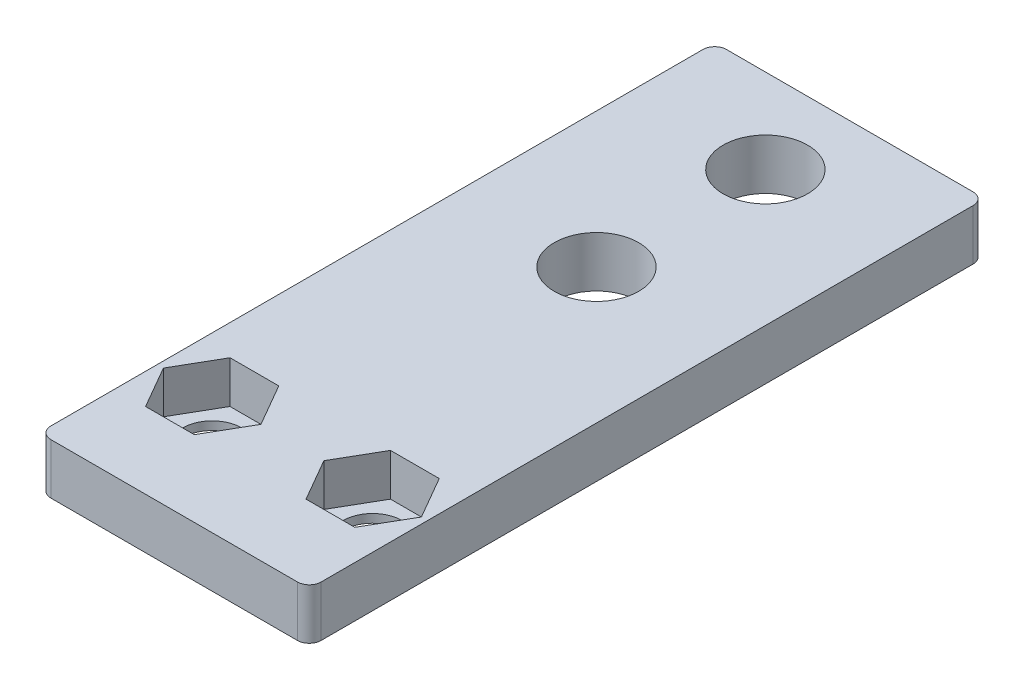
ISO-10303-21;
HEADER;
FILE_DESCRIPTION(('STEP AP214'),'2;1');
FILE_NAME('part.step','',(''),(''),'','','');
FILE_SCHEMA(('AUTOMOTIVE_DESIGN { 1 0 10303 214 1 1 1 1 }'));
ENDSEC;
DATA;
#1=APPLICATION_CONTEXT('core data for automotive mechanical design processes');
#2=APPLICATION_PROTOCOL_DEFINITION('international standard','automotive_design',2000,#1);
#3=PRODUCT_CONTEXT('',#1,'mechanical');
#4=PRODUCT('Part','Part','',(#3));
#5=PRODUCT_RELATED_PRODUCT_CATEGORY('part','',(#4));
#6=PRODUCT_DEFINITION_FORMATION('','',#4);
#7=PRODUCT_DEFINITION_CONTEXT('part definition',#1,'design');
#8=PRODUCT_DEFINITION('design','',#6,#7);
#9=PRODUCT_DEFINITION_SHAPE('','',#8);
#10=(LENGTH_UNIT() NAMED_UNIT(*) SI_UNIT(.MILLI.,.METRE.));
#11=(NAMED_UNIT(*) PLANE_ANGLE_UNIT() SI_UNIT($,.RADIAN.));
#12=(NAMED_UNIT(*) SI_UNIT($,.STERADIAN.) SOLID_ANGLE_UNIT());
#13=UNCERTAINTY_MEASURE_WITH_UNIT(LENGTH_MEASURE(1.E-05),#10,'distance_accuracy_value','');
#14=(GEOMETRIC_REPRESENTATION_CONTEXT(3) GLOBAL_UNCERTAINTY_ASSIGNED_CONTEXT((#13)) GLOBAL_UNIT_ASSIGNED_CONTEXT((#10,
#11,#12)) REPRESENTATION_CONTEXT('',''));
#15=CARTESIAN_POINT('',(0.,0.,0.));
#16=DIRECTION('',(0.,0.,1.));
#17=DIRECTION('',(1.,0.,0.));
#18=AXIS2_PLACEMENT_3D('',#15,#16,#17);
#19=CARTESIAN_POINT('',(0.,3.,0.));
#20=DIRECTION('',(0.,0.,-1.));
#21=DIRECTION('',(-1.,0.,0.));
#22=AXIS2_PLACEMENT_3D('',#19,#20,#21);
#23=PLANE('',#22);
#24=DIRECTION('',(1.,0.,0.));
#25=VECTOR('',#24,1.);
#26=CARTESIAN_POINT('',(0.,3.,0.));
#27=LINE('',#26,#25);
#28=CARTESIAN_POINT('',(0.7,3.,0.));
#29=VERTEX_POINT('',#28);
#30=CARTESIAN_POINT('',(15.3,3.,0.));
#31=VERTEX_POINT('',#30);
#32=EDGE_CURVE('E312',#29,#31,#27,.T.);
#33=ORIENTED_EDGE('',*,*,#32,.F.);
#34=DIRECTION('',(0.,-1.,0.));
#35=VECTOR('',#34,1.);
#36=CARTESIAN_POINT('',(0.7,0.,0.));
#37=LINE('',#36,#35);
#38=CARTESIAN_POINT('',(0.7,0.,0.));
#39=VERTEX_POINT('',#38);
#40=EDGE_CURVE('E390',#29,#39,#37,.T.);
#41=ORIENTED_EDGE('',*,*,#40,.T.);
#42=DIRECTION('',(1.,0.,0.));
#43=VECTOR('',#42,1.);
#44=CARTESIAN_POINT('',(0.,0.,0.));
#45=LINE('',#44,#43);
#46=CARTESIAN_POINT('',(15.3,0.,0.));
#47=VERTEX_POINT('',#46);
#48=EDGE_CURVE('E333',#39,#47,#45,.T.);
#49=ORIENTED_EDGE('',*,*,#48,.T.);
#50=DIRECTION('',(0.,-1.,0.));
#51=VECTOR('',#50,1.);
#52=CARTESIAN_POINT('',(15.3,3.,0.));
#53=LINE('',#52,#51);
#54=EDGE_CURVE('E372',#47,#31,#53,.F.);
#55=ORIENTED_EDGE('',*,*,#54,.T.);
#56=EDGE_LOOP('',(#33,#41,#49,#55));
#57=FACE_BOUND('',#56,.T.);
#58=ADVANCED_FACE('F41',(#57),#23,.F.);
#59=CARTESIAN_POINT('',(16.,3.,0.));
#60=DIRECTION('',(-1.,0.,0.));
#61=DIRECTION('',(0.,0.,1.));
#62=AXIS2_PLACEMENT_3D('',#59,#60,#61);
#63=PLANE('',#62);
#64=DIRECTION('',(0.,0.,-1.));
#65=VECTOR('',#64,1.);
#66=CARTESIAN_POINT('',(16.,3.,0.));
#67=LINE('',#66,#65);
#68=CARTESIAN_POINT('',(16.,3.,-0.7));
#69=VERTEX_POINT('',#68);
#70=CARTESIAN_POINT('',(16.,3.,-39.3));
#71=VERTEX_POINT('',#70);
#72=EDGE_CURVE('E316',#69,#71,#67,.T.);
#73=ORIENTED_EDGE('',*,*,#72,.F.);
#74=DIRECTION('',(0.,-1.,0.));
#75=VECTOR('',#74,1.);
#76=CARTESIAN_POINT('',(16.,3.,-0.7));
#77=LINE('',#76,#75);
#78=CARTESIAN_POINT('',(16.,0.,-0.7));
#79=VERTEX_POINT('',#78);
#80=EDGE_CURVE('E427',#69,#79,#77,.T.);
#81=ORIENTED_EDGE('',*,*,#80,.T.);
#82=DIRECTION('',(0.,0.,-1.));
#83=VECTOR('',#82,1.);
#84=CARTESIAN_POINT('',(16.,0.,0.));
#85=LINE('',#84,#83);
#86=CARTESIAN_POINT('',(16.,0.,-39.3));
#87=VERTEX_POINT('',#86);
#88=EDGE_CURVE('E337',#79,#87,#85,.T.);
#89=ORIENTED_EDGE('',*,*,#88,.T.);
#90=DIRECTION('',(0.,-1.,0.));
#91=VECTOR('',#90,1.);
#92=CARTESIAN_POINT('',(16.,3.,-39.3));
#93=LINE('',#92,#91);
#94=EDGE_CURVE('E424',#87,#71,#93,.F.);
#95=ORIENTED_EDGE('',*,*,#94,.T.);
#96=EDGE_LOOP('',(#73,#81,#89,#95));
#97=FACE_BOUND('',#96,.T.);
#98=ADVANCED_FACE('F435',(#97),#63,.F.);
#99=CARTESIAN_POINT('',(0.,3.,-40.));
#100=DIRECTION('',(0.,0.,-1.));
#101=DIRECTION('',(-1.,0.,0.));
#102=AXIS2_PLACEMENT_3D('',#99,#100,#101);
#103=PLANE('',#102);
#104=DIRECTION('',(1.,0.,0.));
#105=VECTOR('',#104,1.);
#106=CARTESIAN_POINT('',(0.,3.,-40.));
#107=LINE('',#106,#105);
#108=CARTESIAN_POINT('',(0.7,3.,-40.));
#109=VERTEX_POINT('',#108);
#110=CARTESIAN_POINT('',(15.3,3.,-40.));
#111=VERTEX_POINT('',#110);
#112=EDGE_CURVE('E319',#109,#111,#107,.T.);
#113=ORIENTED_EDGE('',*,*,#112,.T.);
#114=DIRECTION('',(0.,-1.,0.));
#115=VECTOR('',#114,1.);
#116=CARTESIAN_POINT('',(15.3,0.,-40.));
#117=LINE('',#116,#115);
#118=CARTESIAN_POINT('',(15.3,0.,-40.));
#119=VERTEX_POINT('',#118);
#120=EDGE_CURVE('E11',#111,#119,#117,.T.);
#121=ORIENTED_EDGE('',*,*,#120,.T.);
#122=DIRECTION('',(1.,0.,0.));
#123=VECTOR('',#122,1.);
#124=CARTESIAN_POINT('',(0.,0.,-40.));
#125=LINE('',#124,#123);
#126=CARTESIAN_POINT('',(0.7,0.,-40.));
#127=VERTEX_POINT('',#126);
#128=EDGE_CURVE('E341',#127,#119,#125,.T.);
#129=ORIENTED_EDGE('',*,*,#128,.F.);
#130=DIRECTION('',(0.,-1.,0.));
#131=VECTOR('',#130,1.);
#132=CARTESIAN_POINT('',(0.7,3.,-40.));
#133=LINE('',#132,#131);
#134=EDGE_CURVE('E50',#127,#109,#133,.F.);
#135=ORIENTED_EDGE('',*,*,#134,.T.);
#136=EDGE_LOOP('',(#113,#121,#129,#135));
#137=FACE_BOUND('',#136,.T.);
#138=ADVANCED_FACE('F446',(#137),#103,.T.);
#139=CARTESIAN_POINT('',(7.63365242270663,3.,-4.40729128114969));
#140=DIRECTION('',(-0.866025403784439,0.,0.499999999999999));
#141=DIRECTION('',(0.499999999999999,0.,0.866025403784439));
#142=AXIS2_PLACEMENT_3D('',#139,#140,#141);
#143=PLANE('',#142);
#144=DIRECTION('',(-0.499999999999999,0.,-0.86602540378444));
#145=VECTOR('',#144,1.);
#146=CARTESIAN_POINT('',(7.63365242270663,0.5,-4.40729128114969));
#147=LINE('',#146,#145);
#148=CARTESIAN_POINT('',(6.13675134594812,0.5,-6.99999999999999));
#149=VERTEX_POINT('',#148);
#150=CARTESIAN_POINT('',(4.69337567297406,0.5,-9.5));
#151=VERTEX_POINT('',#150);
#152=EDGE_CURVE('E234',#149,#151,#147,.T.);
#153=ORIENTED_EDGE('',*,*,#152,.F.);
#154=DIRECTION('',(0.,-1.,0.));
#155=VECTOR('',#154,1.);
#156=CARTESIAN_POINT('',(6.13675134594812,3.,-6.99999999999999));
#157=LINE('',#156,#155);
#158=CARTESIAN_POINT('',(6.13675134594812,3.,-6.99999999999999));
#159=VERTEX_POINT('',#158);
#160=EDGE_CURVE('E368',#159,#149,#157,.T.);
#161=ORIENTED_EDGE('',*,*,#160,.F.);
#162=DIRECTION('',(-0.499999999999999,0.,-0.86602540378444));
#163=VECTOR('',#162,1.);
#164=CARTESIAN_POINT('',(7.63365242270663,3.,-4.40729128114969));
#165=LINE('',#164,#163);
#166=CARTESIAN_POINT('',(4.69337567297406,3.,-9.5));
#167=VERTEX_POINT('',#166);
#168=EDGE_CURVE('E288',#159,#167,#165,.T.);
#169=ORIENTED_EDGE('',*,*,#168,.T.);
#170=DIRECTION('',(0.,-1.,0.));
#171=VECTOR('',#170,1.);
#172=CARTESIAN_POINT('',(4.69337567297406,3.,-9.5));
#173=LINE('',#172,#171);
#174=EDGE_CURVE('E348',#167,#151,#173,.T.);
#175=ORIENTED_EDGE('',*,*,#174,.T.);
#176=EDGE_LOOP('',(#153,#161,#169,#175));
#177=FACE_BOUND('',#176,.T.);
#178=ADVANCED_FACE('F499',(#177),#143,.T.);
#179=CARTESIAN_POINT('',(1.57147459621556,3.,0.907291281149712));
#180=DIRECTION('',(-0.866025403784438,0.,-0.500000000000001));
#181=DIRECTION('',(-0.500000000000001,0.,0.866025403784438));
#182=AXIS2_PLACEMENT_3D('',#179,#180,#181);
#183=PLANE('',#182);
#184=DIRECTION('',(0.500000000000001,0.,-0.866025403784438));
#185=VECTOR('',#184,1.);
#186=CARTESIAN_POINT('',(1.57147459621556,0.5,0.907291281149712));
#187=LINE('',#186,#185);
#188=CARTESIAN_POINT('',(4.69337567297407,0.5,-4.5));
#189=VERTEX_POINT('',#188);
#190=EDGE_CURVE('E230',#189,#149,#187,.T.);
#191=ORIENTED_EDGE('',*,*,#190,.F.);
#192=DIRECTION('',(0.,-1.,0.));
#193=VECTOR('',#192,1.);
#194=CARTESIAN_POINT('',(4.69337567297407,3.,-4.5));
#195=LINE('',#194,#193);
#196=CARTESIAN_POINT('',(4.69337567297407,3.,-4.5));
#197=VERTEX_POINT('',#196);
#198=EDGE_CURVE('E364',#197,#189,#195,.T.);
#199=ORIENTED_EDGE('',*,*,#198,.F.);
#200=DIRECTION('',(0.500000000000001,0.,-0.866025403784438));
#201=VECTOR('',#200,1.);
#202=CARTESIAN_POINT('',(1.57147459621556,3.,0.907291281149712));
#203=LINE('',#202,#201);
#204=EDGE_CURVE('E292',#197,#159,#203,.T.);
#205=ORIENTED_EDGE('',*,*,#204,.T.);
#206=ORIENTED_EDGE('',*,*,#160,.T.);
#207=EDGE_LOOP('',(#191,#199,#205,#206));
#208=FACE_BOUND('',#207,.T.);
#209=ADVANCED_FACE('F495',(#208),#183,.T.);
#210=CARTESIAN_POINT('',(0.,3.,-4.5));
#211=DIRECTION('',(0.,0.,-1.));
#212=DIRECTION('',(-1.,0.,0.));
#213=AXIS2_PLACEMENT_3D('',#210,#211,#212);
#214=PLANE('',#213);
#215=DIRECTION('',(1.,0.,0.));
#216=VECTOR('',#215,1.);
#217=CARTESIAN_POINT('',(0.,0.5,-4.5));
#218=LINE('',#217,#216);
#219=CARTESIAN_POINT('',(1.80662432702594,0.5,-4.5));
#220=VERTEX_POINT('',#219);
#221=EDGE_CURVE('E250',#220,#189,#218,.T.);
#222=ORIENTED_EDGE('',*,*,#221,.F.);
#223=DIRECTION('',(0.,-1.,0.));
#224=VECTOR('',#223,1.);
#225=CARTESIAN_POINT('',(1.80662432702594,3.,-4.5));
#226=LINE('',#225,#224);
#227=CARTESIAN_POINT('',(1.80662432702594,3.,-4.5));
#228=VERTEX_POINT('',#227);
#229=EDGE_CURVE('E360',#228,#220,#226,.T.);
#230=ORIENTED_EDGE('',*,*,#229,.F.);
#231=DIRECTION('',(1.,0.,0.));
#232=VECTOR('',#231,1.);
#233=CARTESIAN_POINT('',(0.,3.,-4.5));
#234=LINE('',#233,#232);
#235=EDGE_CURVE('E296',#228,#197,#234,.T.);
#236=ORIENTED_EDGE('',*,*,#235,.T.);
#237=ORIENTED_EDGE('',*,*,#198,.T.);
#238=EDGE_LOOP('',(#222,#230,#236,#237));
#239=FACE_BOUND('',#238,.T.);
#240=ADVANCED_FACE('F491',(#239),#214,.T.);
#241=CARTESIAN_POINT('',(3.30352540378444,3.,-1.90729128114971));
#242=DIRECTION('',(0.866025403784439,0.,-0.5));
#243=DIRECTION('',(-0.5,0.,-0.866025403784439));
#244=AXIS2_PLACEMENT_3D('',#241,#242,#243);
#245=PLANE('',#244);
#246=DIRECTION('',(0.5,0.,0.866025403784439));
#247=VECTOR('',#246,1.);
#248=CARTESIAN_POINT('',(3.30352540378444,0.5,-1.90729128114971));
#249=LINE('',#248,#247);
#250=CARTESIAN_POINT('',(0.363248654051871,0.5,-7.));
#251=VERTEX_POINT('',#250);
#252=EDGE_CURVE('E246',#251,#220,#249,.T.);
#253=ORIENTED_EDGE('',*,*,#252,.F.);
#254=DIRECTION('',(0.,-1.,0.));
#255=VECTOR('',#254,1.);
#256=CARTESIAN_POINT('',(0.363248654051871,3.,-7.));
#257=LINE('',#256,#255);
#258=CARTESIAN_POINT('',(0.363248654051871,3.,-7.));
#259=VERTEX_POINT('',#258);
#260=EDGE_CURVE('E356',#259,#251,#257,.T.);
#261=ORIENTED_EDGE('',*,*,#260,.F.);
#262=DIRECTION('',(0.5,0.,0.866025403784439));
#263=VECTOR('',#262,1.);
#264=CARTESIAN_POINT('',(3.30352540378444,3.,-1.90729128114971));
#265=LINE('',#264,#263);
#266=EDGE_CURVE('E300',#259,#228,#265,.T.);
#267=ORIENTED_EDGE('',*,*,#266,.T.);
#268=ORIENTED_EDGE('',*,*,#229,.T.);
#269=EDGE_LOOP('',(#253,#261,#267,#268));
#270=FACE_BOUND('',#269,.T.);
#271=ADVANCED_FACE('F487',(#270),#245,.T.);
#272=CARTESIAN_POINT('',(-2.75865242270663,3.,-1.59270871885029));
#273=DIRECTION('',(0.866025403784438,0.,0.5));
#274=DIRECTION('',(0.5,0.,-0.866025403784439));
#275=AXIS2_PLACEMENT_3D('',#272,#273,#274);
#276=PLANE('',#275);
#277=DIRECTION('',(-0.5,0.,0.866025403784439));
#278=VECTOR('',#277,1.);
#279=CARTESIAN_POINT('',(-2.75865242270663,0.5,-1.59270871885029));
#280=LINE('',#279,#278);
#281=CARTESIAN_POINT('',(1.80662432702593,0.5,-9.49999999999999));
#282=VERTEX_POINT('',#281);
#283=EDGE_CURVE('E242',#282,#251,#280,.T.);
#284=ORIENTED_EDGE('',*,*,#283,.F.);
#285=DIRECTION('',(0.,-1.,0.));
#286=VECTOR('',#285,1.);
#287=CARTESIAN_POINT('',(1.80662432702593,3.,-9.49999999999999));
#288=LINE('',#287,#286);
#289=CARTESIAN_POINT('',(1.80662432702593,3.,-9.49999999999999));
#290=VERTEX_POINT('',#289);
#291=EDGE_CURVE('E352',#290,#282,#288,.T.);
#292=ORIENTED_EDGE('',*,*,#291,.F.);
#293=DIRECTION('',(-0.5,0.,0.866025403784439));
#294=VECTOR('',#293,1.);
#295=CARTESIAN_POINT('',(-2.75865242270663,3.,-1.59270871885029));
#296=LINE('',#295,#294);
#297=EDGE_CURVE('E304',#290,#259,#296,.T.);
#298=ORIENTED_EDGE('',*,*,#297,.T.);
#299=ORIENTED_EDGE('',*,*,#260,.T.);
#300=EDGE_LOOP('',(#284,#292,#298,#299));
#301=FACE_BOUND('',#300,.T.);
#302=ADVANCED_FACE('F483',(#301),#276,.T.);
#303=CARTESIAN_POINT('',(0.,3.,-9.5));
#304=DIRECTION('',(0.,0.,1.));
#305=DIRECTION('',(1.,0.,0.));
#306=AXIS2_PLACEMENT_3D('',#303,#304,#305);
#307=PLANE('',#306);
#308=DIRECTION('',(-1.,0.,0.));
#309=VECTOR('',#308,1.);
#310=CARTESIAN_POINT('',(0.,0.5,-9.5));
#311=LINE('',#310,#309);
#312=CARTESIAN_POINT('',(14.1933756729741,0.5,-9.5));
#313=VERTEX_POINT('',#312);
#314=CARTESIAN_POINT('',(11.306624327026,0.5,-9.5));
#315=VERTEX_POINT('',#314);
#316=EDGE_CURVE('E206',#313,#315,#311,.T.);
#317=ORIENTED_EDGE('',*,*,#316,.F.);
#318=DIRECTION('',(0.,-1.,0.));
#319=VECTOR('',#318,1.);
#320=CARTESIAN_POINT('',(14.1933756729741,3.,-9.5));
#321=LINE('',#320,#319);
#322=CARTESIAN_POINT('',(14.1933756729741,3.,-9.5));
#323=VERTEX_POINT('',#322);
#324=EDGE_CURVE('E353',#323,#313,#321,.T.);
#325=ORIENTED_EDGE('',*,*,#324,.F.);
#326=DIRECTION('',(-1.,0.,0.));
#327=VECTOR('',#326,1.);
#328=CARTESIAN_POINT('',(0.,3.,-9.5));
#329=LINE('',#328,#327);
#330=CARTESIAN_POINT('',(11.306624327026,3.,-9.5));
#331=VERTEX_POINT('',#330);
#332=EDGE_CURVE('E267',#323,#331,#329,.T.);
#333=ORIENTED_EDGE('',*,*,#332,.T.);
#334=DIRECTION('',(0.,-1.,0.));
#335=VECTOR('',#334,1.);
#336=CARTESIAN_POINT('',(11.306624327026,3.,-9.5));
#337=LINE('',#336,#335);
#338=EDGE_CURVE('E192',#331,#315,#337,.T.);
#339=ORIENTED_EDGE('',*,*,#338,.T.);
#340=EDGE_LOOP('',(#317,#325,#333,#339));
#341=FACE_BOUND('',#340,.T.);
#342=ADVANCED_FACE('F486',(#341),#307,.T.);
#343=CARTESIAN_POINT('',(14.7586524227067,3.,-8.52091194912579));
#344=DIRECTION('',(-0.866025403784439,0.,0.499999999999999));
#345=DIRECTION('',(0.499999999999999,0.,0.866025403784439));
#346=AXIS2_PLACEMENT_3D('',#343,#344,#345);
#347=PLANE('',#346);
#348=DIRECTION('',(-0.499999999999999,0.,-0.866025403784439));
#349=VECTOR('',#348,1.);
#350=CARTESIAN_POINT('',(14.7586524227067,0.5,-8.52091194912579));
#351=LINE('',#350,#349);
#352=CARTESIAN_POINT('',(15.6367513459482,0.5,-7.));
#353=VERTEX_POINT('',#352);
#354=EDGE_CURVE('E210',#353,#313,#351,.T.);
#355=ORIENTED_EDGE('',*,*,#354,.F.);
#356=DIRECTION('',(0.,-1.,0.));
#357=VECTOR('',#356,1.);
#358=CARTESIAN_POINT('',(15.6367513459482,3.,-7.));
#359=LINE('',#358,#357);
#360=CARTESIAN_POINT('',(15.6367513459482,3.,-7.));
#361=VERTEX_POINT('',#360);
#362=EDGE_CURVE('E381',#361,#353,#359,.T.);
#363=ORIENTED_EDGE('',*,*,#362,.F.);
#364=DIRECTION('',(-0.499999999999999,0.,-0.866025403784439));
#365=VECTOR('',#364,1.);
#366=CARTESIAN_POINT('',(14.7586524227067,3.,-8.52091194912579));
#367=LINE('',#366,#365);
#368=EDGE_CURVE('E271',#361,#323,#367,.T.);
#369=ORIENTED_EDGE('',*,*,#368,.T.);
#370=ORIENTED_EDGE('',*,*,#324,.T.);
#371=EDGE_LOOP('',(#355,#363,#369,#370));
#372=FACE_BOUND('',#371,.T.);
#373=ADVANCED_FACE('F516',(#372),#347,.T.);
#374=CARTESIAN_POINT('',(8.69647459621559,3.,5.02091194912581));
#375=DIRECTION('',(-0.866025403784439,0.,-0.5));
#376=DIRECTION('',(-0.5,0.,0.866025403784439));
#377=AXIS2_PLACEMENT_3D('',#374,#375,#376);
#378=PLANE('',#377);
#379=DIRECTION('',(0.5,0.,-0.866025403784439));
#380=VECTOR('',#379,1.);
#381=CARTESIAN_POINT('',(8.69647459621559,0.5,5.02091194912581));
#382=LINE('',#381,#380);
#383=CARTESIAN_POINT('',(14.1933756729741,0.5,-4.49999999999998));
#384=VERTEX_POINT('',#383);
#385=EDGE_CURVE('E216',#384,#353,#382,.T.);
#386=ORIENTED_EDGE('',*,*,#385,.F.);
#387=DIRECTION('',(0.,-1.,0.));
#388=VECTOR('',#387,1.);
#389=CARTESIAN_POINT('',(14.1933756729741,3.,-4.49999999999998));
#390=LINE('',#389,#388);
#391=CARTESIAN_POINT('',(14.1933756729741,3.,-4.49999999999998));
#392=VERTEX_POINT('',#391);
#393=EDGE_CURVE('E377',#392,#384,#390,.T.);
#394=ORIENTED_EDGE('',*,*,#393,.F.);
#395=DIRECTION('',(0.5,0.,-0.866025403784439));
#396=VECTOR('',#395,1.);
#397=CARTESIAN_POINT('',(8.69647459621559,3.,5.02091194912581));
#398=LINE('',#397,#396);
#399=EDGE_CURVE('E275',#392,#361,#398,.T.);
#400=ORIENTED_EDGE('',*,*,#399,.T.);
#401=ORIENTED_EDGE('',*,*,#362,.T.);
#402=EDGE_LOOP('',(#386,#394,#400,#401));
#403=FACE_BOUND('',#402,.T.);
#404=ADVANCED_FACE('F512',(#403),#378,.T.);
#405=CARTESIAN_POINT('',(0.,3.,-4.49999999999998));
#406=DIRECTION('',(0.,0.,-1.));
#407=DIRECTION('',(-1.,0.,0.));
#408=AXIS2_PLACEMENT_3D('',#405,#406,#407);
#409=PLANE('',#408);
#410=DIRECTION('',(1.,0.,0.));
#411=VECTOR('',#410,1.);
#412=CARTESIAN_POINT('',(0.,0.5,-4.49999999999998));
#413=LINE('',#412,#411);
#414=CARTESIAN_POINT('',(11.306624327026,0.5,-4.49999999999998));
#415=VERTEX_POINT('',#414);
#416=EDGE_CURVE('E201',#415,#384,#413,.T.);
#417=ORIENTED_EDGE('',*,*,#416,.F.);
#418=DIRECTION('',(0.,-1.,0.));
#419=VECTOR('',#418,1.);
#420=CARTESIAN_POINT('',(11.306624327026,3.,-4.49999999999998));
#421=LINE('',#420,#419);
#422=CARTESIAN_POINT('',(11.306624327026,3.,-4.49999999999998));
#423=VERTEX_POINT('',#422);
#424=EDGE_CURVE('E191',#423,#415,#421,.T.);
#425=ORIENTED_EDGE('',*,*,#424,.F.);
#426=DIRECTION('',(1.,0.,0.));
#427=VECTOR('',#426,1.);
#428=CARTESIAN_POINT('',(0.,3.,-4.49999999999998));
#429=LINE('',#428,#427);
#430=EDGE_CURVE('E279',#423,#392,#429,.T.);
#431=ORIENTED_EDGE('',*,*,#430,.T.);
#432=ORIENTED_EDGE('',*,*,#393,.T.);
#433=EDGE_LOOP('',(#417,#425,#431,#432));
#434=FACE_BOUND('',#433,.T.);
#435=ADVANCED_FACE('F509',(#434),#409,.T.);
#436=CARTESIAN_POINT('',(10.4285254037845,3.,-6.02091194912582));
#437=DIRECTION('',(0.866025403784438,0.,-0.5));
#438=DIRECTION('',(-0.5,0.,-0.866025403784439));
#439=AXIS2_PLACEMENT_3D('',#436,#437,#438);
#440=PLANE('',#439);
#441=DIRECTION('',(0.5,0.,0.866025403784439));
#442=VECTOR('',#441,1.);
#443=CARTESIAN_POINT('',(10.4285254037845,0.5,-6.02091194912582));
#444=LINE('',#443,#442);
#445=CARTESIAN_POINT('',(9.86324865405191,0.5,-7.));
#446=VERTEX_POINT('',#445);
#447=EDGE_CURVE('E196',#446,#415,#444,.T.);
#448=ORIENTED_EDGE('',*,*,#447,.F.);
#449=DIRECTION('',(0.,-1.,0.));
#450=VECTOR('',#449,1.);
#451=CARTESIAN_POINT('',(9.86324865405191,3.,-7.));
#452=LINE('',#451,#450);
#453=CARTESIAN_POINT('',(9.86324865405191,3.,-7.));
#454=VERTEX_POINT('',#453);
#455=EDGE_CURVE('E179',#454,#446,#452,.T.);
#456=ORIENTED_EDGE('',*,*,#455,.F.);
#457=DIRECTION('',(0.5,0.,0.866025403784439));
#458=VECTOR('',#457,1.);
#459=CARTESIAN_POINT('',(10.4285254037845,3.,-6.02091194912582));
#460=LINE('',#459,#458);
#461=EDGE_CURVE('E283',#454,#423,#460,.T.);
#462=ORIENTED_EDGE('',*,*,#461,.T.);
#463=ORIENTED_EDGE('',*,*,#424,.T.);
#464=EDGE_LOOP('',(#448,#456,#462,#463));
#465=FACE_BOUND('',#464,.T.);
#466=ADVANCED_FACE('F197',(#465),#440,.T.);
#467=CARTESIAN_POINT('',(0.,3.,-9.49999999999999));
#468=DIRECTION('',(0.,0.,1.));
#469=DIRECTION('',(1.,0.,0.));
#470=AXIS2_PLACEMENT_3D('',#467,#468,#469);
#471=PLANE('',#470);
#472=DIRECTION('',(-1.,0.,0.));
#473=VECTOR('',#472,1.);
#474=CARTESIAN_POINT('',(0.,0.5,-9.49999999999999));
#475=LINE('',#474,#473);
#476=EDGE_CURVE('E238',#151,#282,#475,.T.);
#477=ORIENTED_EDGE('',*,*,#476,.F.);
#478=ORIENTED_EDGE('',*,*,#174,.F.);
#479=DIRECTION('',(-1.,0.,0.));
#480=VECTOR('',#479,1.);
#481=CARTESIAN_POINT('',(0.,3.,-9.49999999999999));
#482=LINE('',#481,#480);
#483=EDGE_CURVE('E308',#167,#290,#482,.T.);
#484=ORIENTED_EDGE('',*,*,#483,.T.);
#485=ORIENTED_EDGE('',*,*,#291,.T.);
#486=EDGE_LOOP('',(#477,#478,#484,#485));
#487=FACE_BOUND('',#486,.T.);
#488=ADVANCED_FACE('F479',(#487),#471,.T.);
#489=CARTESIAN_POINT('',(4.36634757729339,3.,2.52091194912581));
#490=DIRECTION('',(0.866025403784438,0.,0.5));
#491=DIRECTION('',(0.5,0.,-0.866025403784439));
#492=AXIS2_PLACEMENT_3D('',#489,#490,#491);
#493=PLANE('',#492);
#494=DIRECTION('',(-0.5,0.,0.866025403784439));
#495=VECTOR('',#494,1.);
#496=CARTESIAN_POINT('',(4.36634757729339,0.5,2.52091194912581));
#497=LINE('',#496,#495);
#498=EDGE_CURVE('E183',#315,#446,#497,.T.);
#499=ORIENTED_EDGE('',*,*,#498,.F.);
#500=ORIENTED_EDGE('',*,*,#338,.F.);
#501=DIRECTION('',(-0.5,0.,0.866025403784439));
#502=VECTOR('',#501,1.);
#503=CARTESIAN_POINT('',(4.36634757729339,3.,2.52091194912581));
#504=LINE('',#503,#502);
#505=EDGE_CURVE('E186',#331,#454,#504,.T.);
#506=ORIENTED_EDGE('',*,*,#505,.T.);
#507=ORIENTED_EDGE('',*,*,#455,.T.);
#508=EDGE_LOOP('',(#499,#500,#506,#507));
#509=FACE_BOUND('',#508,.T.);
#510=ADVANCED_FACE('F181',(#509),#493,.T.);
#511=CARTESIAN_POINT('',(8.,3.,-35.));
#512=DIRECTION('',(0.,-1.,0.));
#513=DIRECTION('',(0.,0.,-1.));
#514=AXIS2_PLACEMENT_3D('',#511,#512,#513);
#515=CYLINDRICAL_SURFACE('',#514,2.5);
#516=CARTESIAN_POINT('',(8.,3.,-35.));
#517=DIRECTION('',(0.,1.,0.));
#518=DIRECTION('',(0.,0.,1.));
#519=AXIS2_PLACEMENT_3D('',#516,#517,#518);
#520=CIRCLE('',#519,2.5);
#521=CARTESIAN_POINT('',(8.,3.,-32.5));
#522=VERTEX_POINT('',#521);
#523=EDGE_CURVE('E262',#522,#522,#520,.T.);
#524=ORIENTED_EDGE('',*,*,#523,.T.);
#525=EDGE_LOOP('',(#524));
#526=FACE_BOUND('',#525,.T.);
#527=CARTESIAN_POINT('',(8.,0.,-35.));
#528=DIRECTION('',(0.,1.,0.));
#529=DIRECTION('',(0.,0.,1.));
#530=AXIS2_PLACEMENT_3D('',#527,#528,#529);
#531=CIRCLE('',#530,2.5);
#532=CARTESIAN_POINT('',(8.,0.,-32.5));
#533=VERTEX_POINT('',#532);
#534=EDGE_CURVE('E329',#533,#533,#531,.T.);
#535=ORIENTED_EDGE('',*,*,#534,.F.);
#536=EDGE_LOOP('',(#535));
#537=FACE_BOUND('',#536,.T.);
#538=ADVANCED_FACE('F506',(#526,#537),#515,.F.);
#539=CARTESIAN_POINT('',(8.,3.,-25.));
#540=DIRECTION('',(0.,-1.,0.));
#541=DIRECTION('',(0.,0.,-1.));
#542=AXIS2_PLACEMENT_3D('',#539,#540,#541);
#543=CYLINDRICAL_SURFACE('',#542,2.5);
#544=CARTESIAN_POINT('',(8.,3.,-25.));
#545=DIRECTION('',(0.,1.,0.));
#546=DIRECTION('',(0.,0.,1.));
#547=AXIS2_PLACEMENT_3D('',#544,#545,#546);
#548=CIRCLE('',#547,2.5);
#549=CARTESIAN_POINT('',(8.,3.,-22.5));
#550=VERTEX_POINT('',#549);
#551=EDGE_CURVE('E258',#550,#550,#548,.T.);
#552=ORIENTED_EDGE('',*,*,#551,.T.);
#553=EDGE_LOOP('',(#552));
#554=FACE_BOUND('',#553,.T.);
#555=CARTESIAN_POINT('',(8.,0.,-25.));
#556=DIRECTION('',(0.,1.,0.));
#557=DIRECTION('',(0.,0.,1.));
#558=AXIS2_PLACEMENT_3D('',#555,#556,#557);
#559=CIRCLE('',#558,2.5);
#560=CARTESIAN_POINT('',(8.,0.,-22.5));
#561=VERTEX_POINT('',#560);
#562=EDGE_CURVE('E254',#561,#561,#559,.T.);
#563=ORIENTED_EDGE('',*,*,#562,.F.);
#564=EDGE_LOOP('',(#563));
#565=FACE_BOUND('',#564,.T.);
#566=ADVANCED_FACE('F526',(#554,#565),#543,.F.);
#567=CARTESIAN_POINT('',(0.,3.,0.));
#568=DIRECTION('',(-1.,0.,0.));
#569=DIRECTION('',(0.,0.,1.));
#570=AXIS2_PLACEMENT_3D('',#567,#568,#569);
#571=PLANE('',#570);
#572=DIRECTION('',(0.,0.,-1.));
#573=VECTOR('',#572,1.);
#574=CARTESIAN_POINT('',(0.,0.,0.));
#575=LINE('',#574,#573);
#576=CARTESIAN_POINT('',(0.,0.,-0.7));
#577=VERTEX_POINT('',#576);
#578=CARTESIAN_POINT('',(0.,0.,-39.3));
#579=VERTEX_POINT('',#578);
#580=EDGE_CURVE('E263',#577,#579,#575,.T.);
#581=ORIENTED_EDGE('',*,*,#580,.F.);
#582=DIRECTION('',(0.,-1.,0.));
#583=VECTOR('',#582,1.);
#584=CARTESIAN_POINT('',(0.,3.,-0.7));
#585=LINE('',#584,#583);
#586=CARTESIAN_POINT('',(0.,3.,-0.7));
#587=VERTEX_POINT('',#586);
#588=EDGE_CURVE('E410',#577,#587,#585,.F.);
#589=ORIENTED_EDGE('',*,*,#588,.T.);
#590=DIRECTION('',(0.,0.,-1.));
#591=VECTOR('',#590,1.);
#592=CARTESIAN_POINT('',(0.,3.,0.));
#593=LINE('',#592,#591);
#594=CARTESIAN_POINT('',(0.,3.,-39.3));
#595=VERTEX_POINT('',#594);
#596=EDGE_CURVE('E322',#587,#595,#593,.T.);
#597=ORIENTED_EDGE('',*,*,#596,.T.);
#598=DIRECTION('',(0.,-1.,0.));
#599=VECTOR('',#598,1.);
#600=CARTESIAN_POINT('',(0.,3.,-39.3));
#601=LINE('',#600,#599);
#602=EDGE_CURVE('E406',#595,#579,#601,.T.);
#603=ORIENTED_EDGE('',*,*,#602,.T.);
#604=EDGE_LOOP('',(#581,#589,#597,#603));
#605=FACE_BOUND('',#604,.T.);
#606=ADVANCED_FACE('F454',(#605),#571,.T.);
#607=CARTESIAN_POINT('',(0.,3.,0.));
#608=DIRECTION('',(0.,1.,0.));
#609=DIRECTION('',(0.,0.,1.));
#610=AXIS2_PLACEMENT_3D('',#607,#608,#609);
#611=PLANE('',#610);
#612=ORIENTED_EDGE('',*,*,#551,.F.);
#613=EDGE_LOOP('',(#612));
#614=FACE_BOUND('',#613,.T.);
#615=ORIENTED_EDGE('',*,*,#523,.F.);
#616=EDGE_LOOP('',(#615));
#617=FACE_BOUND('',#616,.T.);
#618=ORIENTED_EDGE('',*,*,#332,.F.);
#619=ORIENTED_EDGE('',*,*,#368,.F.);
#620=ORIENTED_EDGE('',*,*,#399,.F.);
#621=ORIENTED_EDGE('',*,*,#430,.F.);
#622=ORIENTED_EDGE('',*,*,#461,.F.);
#623=ORIENTED_EDGE('',*,*,#505,.F.);
#624=EDGE_LOOP('',(#618,#619,#620,#621,#622,#623));
#625=FACE_BOUND('',#624,.T.);
#626=ORIENTED_EDGE('',*,*,#168,.F.);
#627=ORIENTED_EDGE('',*,*,#204,.F.);
#628=ORIENTED_EDGE('',*,*,#235,.F.);
#629=ORIENTED_EDGE('',*,*,#266,.F.);
#630=ORIENTED_EDGE('',*,*,#297,.F.);
#631=ORIENTED_EDGE('',*,*,#483,.F.);
#632=EDGE_LOOP('',(#626,#627,#628,#629,#630,#631));
#633=FACE_BOUND('',#632,.T.);
#634=ORIENTED_EDGE('',*,*,#596,.F.);
#635=CARTESIAN_POINT('',(0.7,3.,-0.7));
#636=DIRECTION('',(0.,1.,0.));
#637=DIRECTION('',(0.,0.,1.));
#638=AXIS2_PLACEMENT_3D('',#635,#636,#637);
#639=CIRCLE('',#638,0.7);
#640=EDGE_CURVE('E421',#587,#29,#639,.T.);
#641=ORIENTED_EDGE('',*,*,#640,.T.);
#642=ORIENTED_EDGE('',*,*,#32,.T.);
#643=CARTESIAN_POINT('',(15.3,3.,-0.7));
#644=DIRECTION('',(0.,1.,0.));
#645=DIRECTION('',(0.,0.,1.));
#646=AXIS2_PLACEMENT_3D('',#643,#644,#645);
#647=CIRCLE('',#646,0.7);
#648=EDGE_CURVE('E418',#31,#69,#647,.T.);
#649=ORIENTED_EDGE('',*,*,#648,.T.);
#650=ORIENTED_EDGE('',*,*,#72,.T.);
#651=CARTESIAN_POINT('',(15.3,3.,-39.3));
#652=DIRECTION('',(0.,1.,0.));
#653=DIRECTION('',(0.,0.,1.));
#654=AXIS2_PLACEMENT_3D('',#651,#652,#653);
#655=CIRCLE('',#654,0.7);
#656=EDGE_CURVE('E57',#71,#111,#655,.T.);
#657=ORIENTED_EDGE('',*,*,#656,.T.);
#658=ORIENTED_EDGE('',*,*,#112,.F.);
#659=CARTESIAN_POINT('',(0.7,3.,-39.3));
#660=DIRECTION('',(0.,1.,0.));
#661=DIRECTION('',(0.,0.,1.));
#662=AXIS2_PLACEMENT_3D('',#659,#660,#661);
#663=CIRCLE('',#662,0.7);
#664=EDGE_CURVE('E413',#109,#595,#663,.T.);
#665=ORIENTED_EDGE('',*,*,#664,.T.);
#666=EDGE_LOOP('',(#634,#641,#642,#649,#650,#657,#658,#665));
#667=FACE_BOUND('',#666,.T.);
#668=ADVANCED_FACE('F449',(#614,#617,#625,#633,#667),#611,.T.);
#669=CARTESIAN_POINT('',(0.,0.,0.));
#670=DIRECTION('',(0.,1.,0.));
#671=DIRECTION('',(0.,0.,1.));
#672=AXIS2_PLACEMENT_3D('',#669,#670,#671);
#673=PLANE('',#672);
#674=ORIENTED_EDGE('',*,*,#562,.T.);
#675=EDGE_LOOP('',(#674));
#676=FACE_BOUND('',#675,.T.);
#677=ORIENTED_EDGE('',*,*,#534,.T.);
#678=EDGE_LOOP('',(#677));
#679=FACE_BOUND('',#678,.T.);
#680=ORIENTED_EDGE('',*,*,#48,.F.);
#681=CARTESIAN_POINT('',(0.7,0.,-0.7));
#682=DIRECTION('',(0.,1.,0.));
#683=DIRECTION('',(0.,0.,1.));
#684=AXIS2_PLACEMENT_3D('',#681,#682,#683);
#685=CIRCLE('',#684,0.7);
#686=EDGE_CURVE('E403',#39,#577,#685,.F.);
#687=ORIENTED_EDGE('',*,*,#686,.T.);
#688=ORIENTED_EDGE('',*,*,#580,.T.);
#689=CARTESIAN_POINT('',(0.7,0.,-39.3));
#690=DIRECTION('',(0.,1.,0.));
#691=DIRECTION('',(0.,0.,1.));
#692=AXIS2_PLACEMENT_3D('',#689,#690,#691);
#693=CIRCLE('',#692,0.7);
#694=EDGE_CURVE('E394',#579,#127,#693,.F.);
#695=ORIENTED_EDGE('',*,*,#694,.T.);
#696=ORIENTED_EDGE('',*,*,#128,.T.);
#697=CARTESIAN_POINT('',(15.3,0.,-39.3));
#698=DIRECTION('',(0.,1.,0.));
#699=DIRECTION('',(0.,0.,1.));
#700=AXIS2_PLACEMENT_3D('',#697,#698,#699);
#701=CIRCLE('',#700,0.7);
#702=EDGE_CURVE('E397',#119,#87,#701,.F.);
#703=ORIENTED_EDGE('',*,*,#702,.T.);
#704=ORIENTED_EDGE('',*,*,#88,.F.);
#705=CARTESIAN_POINT('',(15.3,0.,-0.7));
#706=DIRECTION('',(0.,1.,0.));
#707=DIRECTION('',(0.,0.,1.));
#708=AXIS2_PLACEMENT_3D('',#705,#706,#707);
#709=CIRCLE('',#708,0.7);
#710=EDGE_CURVE('E400',#79,#47,#709,.F.);
#711=ORIENTED_EDGE('',*,*,#710,.T.);
#712=EDGE_LOOP('',(#680,#687,#688,#695,#696,#703,#704,#711));
#713=FACE_BOUND('',#712,.T.);
#714=CARTESIAN_POINT('',(3.25,0.,-7.));
#715=DIRECTION('',(0.,1.,0.));
#716=DIRECTION('',(0.,0.,1.));
#717=AXIS2_PLACEMENT_3D('',#714,#715,#716);
#718=CIRCLE('',#717,1.75);
#719=CARTESIAN_POINT('',(3.25,0.,-5.25));
#720=VERTEX_POINT('',#719);
#721=EDGE_CURVE('E220',#720,#720,#718,.T.);
#722=ORIENTED_EDGE('',*,*,#721,.T.);
#723=EDGE_LOOP('',(#722));
#724=FACE_BOUND('',#723,.T.);
#725=CARTESIAN_POINT('',(12.75,0.,-7.));
#726=DIRECTION('',(0.,1.,0.));
#727=DIRECTION('',(0.,0.,1.));
#728=AXIS2_PLACEMENT_3D('',#725,#726,#727);
#729=CIRCLE('',#728,1.75);
#730=CARTESIAN_POINT('',(12.75,0.,-5.25));
#731=VERTEX_POINT('',#730);
#732=EDGE_CURVE('E221',#731,#731,#729,.T.);
#733=ORIENTED_EDGE('',*,*,#732,.T.);
#734=EDGE_LOOP('',(#733));
#735=FACE_BOUND('',#734,.T.);
#736=ADVANCED_FACE('F441',(#676,#679,#713,#724,#735),#673,.F.);
#737=CARTESIAN_POINT('',(3.25,0.5,-7.));
#738=DIRECTION('',(0.,-1.,0.));
#739=DIRECTION('',(0.,0.,-1.));
#740=AXIS2_PLACEMENT_3D('',#737,#738,#739);
#741=CYLINDRICAL_SURFACE('',#740,1.75);
#742=CARTESIAN_POINT('',(3.25,0.5,-7.));
#743=DIRECTION('',(0.,1.,0.));
#744=DIRECTION('',(0.,0.,1.));
#745=AXIS2_PLACEMENT_3D('',#742,#743,#744);
#746=CIRCLE('',#745,1.75);
#747=CARTESIAN_POINT('',(3.25,0.5,-5.25));
#748=VERTEX_POINT('',#747);
#749=EDGE_CURVE('E226',#748,#748,#746,.T.);
#750=ORIENTED_EDGE('',*,*,#749,.T.);
#751=EDGE_LOOP('',(#750));
#752=FACE_BOUND('',#751,.T.);
#753=ORIENTED_EDGE('',*,*,#721,.F.);
#754=EDGE_LOOP('',(#753));
#755=FACE_BOUND('',#754,.T.);
#756=ADVANCED_FACE('F540',(#752,#755),#741,.F.);
#757=CARTESIAN_POINT('',(0.,0.5,0.));
#758=DIRECTION('',(0.,1.,0.));
#759=DIRECTION('',(0.,0.,1.));
#760=AXIS2_PLACEMENT_3D('',#757,#758,#759);
#761=PLANE('',#760);
#762=ORIENTED_EDGE('',*,*,#749,.F.);
#763=EDGE_LOOP('',(#762));
#764=FACE_BOUND('',#763,.T.);
#765=ORIENTED_EDGE('',*,*,#190,.T.);
#766=ORIENTED_EDGE('',*,*,#152,.T.);
#767=ORIENTED_EDGE('',*,*,#476,.T.);
#768=ORIENTED_EDGE('',*,*,#283,.T.);
#769=ORIENTED_EDGE('',*,*,#252,.T.);
#770=ORIENTED_EDGE('',*,*,#221,.T.);
#771=EDGE_LOOP('',(#765,#766,#767,#768,#769,#770));
#772=FACE_BOUND('',#771,.T.);
#773=ADVANCED_FACE('F548',(#764,#772),#761,.T.);
#774=CARTESIAN_POINT('',(12.75,0.5,-7.));
#775=DIRECTION('',(0.,-1.,0.));
#776=DIRECTION('',(0.,0.,-1.));
#777=AXIS2_PLACEMENT_3D('',#774,#775,#776);
#778=CYLINDRICAL_SURFACE('',#777,1.75);
#779=CARTESIAN_POINT('',(12.75,0.5,-7.));
#780=DIRECTION('',(0.,1.,0.));
#781=DIRECTION('',(0.,0.,1.));
#782=AXIS2_PLACEMENT_3D('',#779,#780,#781);
#783=CIRCLE('',#782,1.75);
#784=CARTESIAN_POINT('',(12.75,0.5,-5.25));
#785=VERTEX_POINT('',#784);
#786=EDGE_CURVE('E225',#785,#785,#783,.T.);
#787=ORIENTED_EDGE('',*,*,#786,.T.);
#788=EDGE_LOOP('',(#787));
#789=FACE_BOUND('',#788,.T.);
#790=ORIENTED_EDGE('',*,*,#732,.F.);
#791=EDGE_LOOP('',(#790));
#792=FACE_BOUND('',#791,.T.);
#793=ADVANCED_FACE('F650',(#789,#792),#778,.F.);
#794=CARTESIAN_POINT('',(0.,0.5,0.));
#795=DIRECTION('',(0.,1.,0.));
#796=DIRECTION('',(0.,0.,1.));
#797=AXIS2_PLACEMENT_3D('',#794,#795,#796);
#798=PLANE('',#797);
#799=ORIENTED_EDGE('',*,*,#786,.F.);
#800=EDGE_LOOP('',(#799));
#801=FACE_BOUND('',#800,.T.);
#802=ORIENTED_EDGE('',*,*,#354,.T.);
#803=ORIENTED_EDGE('',*,*,#316,.T.);
#804=ORIENTED_EDGE('',*,*,#498,.T.);
#805=ORIENTED_EDGE('',*,*,#447,.T.);
#806=ORIENTED_EDGE('',*,*,#416,.T.);
#807=ORIENTED_EDGE('',*,*,#385,.T.);
#808=EDGE_LOOP('',(#802,#803,#804,#805,#806,#807));
#809=FACE_BOUND('',#808,.T.);
#810=ADVANCED_FACE('F205',(#801,#809),#798,.T.);
#811=CARTESIAN_POINT('',(0.7,3.,-0.7));
#812=DIRECTION('',(0.,1.,0.));
#813=DIRECTION('',(0.,0.,1.));
#814=AXIS2_PLACEMENT_3D('',#811,#812,#813);
#815=CYLINDRICAL_SURFACE('',#814,0.7);
#816=ORIENTED_EDGE('',*,*,#640,.F.);
#817=ORIENTED_EDGE('',*,*,#588,.F.);
#818=ORIENTED_EDGE('',*,*,#686,.F.);
#819=ORIENTED_EDGE('',*,*,#40,.F.);
#820=EDGE_LOOP('',(#816,#817,#818,#819));
#821=FACE_BOUND('',#820,.T.);
#822=ADVANCED_FACE('F459',(#821),#815,.T.);
#823=CARTESIAN_POINT('',(15.3,3.,-0.7));
#824=DIRECTION('',(0.,-1.,0.));
#825=DIRECTION('',(0.,0.,-1.));
#826=AXIS2_PLACEMENT_3D('',#823,#824,#825);
#827=CYLINDRICAL_SURFACE('',#826,0.7);
#828=ORIENTED_EDGE('',*,*,#648,.F.);
#829=ORIENTED_EDGE('',*,*,#54,.F.);
#830=ORIENTED_EDGE('',*,*,#710,.F.);
#831=ORIENTED_EDGE('',*,*,#80,.F.);
#832=EDGE_LOOP('',(#828,#829,#830,#831));
#833=FACE_BOUND('',#832,.T.);
#834=ADVANCED_FACE('F463',(#833),#827,.T.);
#835=CARTESIAN_POINT('',(15.3,3.,-39.3));
#836=DIRECTION('',(0.,1.,0.));
#837=DIRECTION('',(0.,0.,1.));
#838=AXIS2_PLACEMENT_3D('',#835,#836,#837);
#839=CYLINDRICAL_SURFACE('',#838,0.7);
#840=ORIENTED_EDGE('',*,*,#656,.F.);
#841=ORIENTED_EDGE('',*,*,#94,.F.);
#842=ORIENTED_EDGE('',*,*,#702,.F.);
#843=ORIENTED_EDGE('',*,*,#120,.F.);
#844=EDGE_LOOP('',(#840,#841,#842,#843));
#845=FACE_BOUND('',#844,.T.);
#846=ADVANCED_FACE('F445',(#845),#839,.T.);
#847=CARTESIAN_POINT('',(0.7,3.,-39.3));
#848=DIRECTION('',(0.,-1.,0.));
#849=DIRECTION('',(0.,0.,-1.));
#850=AXIS2_PLACEMENT_3D('',#847,#848,#849);
#851=CYLINDRICAL_SURFACE('',#850,0.7);
#852=ORIENTED_EDGE('',*,*,#664,.F.);
#853=ORIENTED_EDGE('',*,*,#134,.F.);
#854=ORIENTED_EDGE('',*,*,#694,.F.);
#855=ORIENTED_EDGE('',*,*,#602,.F.);
#856=EDGE_LOOP('',(#852,#853,#854,#855));
#857=FACE_BOUND('',#856,.T.);
#858=ADVANCED_FACE('F43',(#857),#851,.T.);
#859=CLOSED_SHELL('',(#58,#98,#138,#178,#209,#240,#271,#302,#342,#373,#404,#435,#466,#488,#510,
#538,#566,#606,#668,#736,#756,#773,#793,#810,#822,#834,#846,#858));
#860=MANIFOLD_SOLID_BREP('B2',#859);
#861=ADVANCED_BREP_SHAPE_REPRESENTATION('',(#18,#860),#14);
#862=SHAPE_DEFINITION_REPRESENTATION(#9,#861);
ENDSEC;
END-ISO-10303-21;
